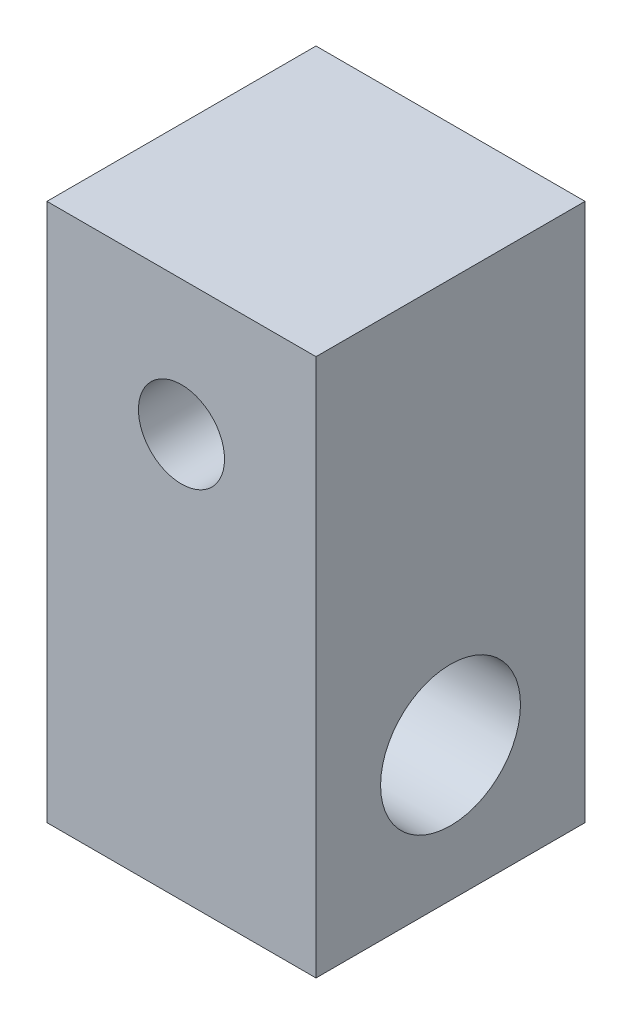
ISO-10303-21;
HEADER;
FILE_DESCRIPTION(('STEP AP214'),'2;1');
FILE_NAME('part.step','',(''),(''),'','','');
FILE_SCHEMA(('AUTOMOTIVE_DESIGN { 1 0 10303 214 1 1 1 1 }'));
ENDSEC;
DATA;
#1=APPLICATION_CONTEXT('core data for automotive mechanical design processes');
#2=APPLICATION_PROTOCOL_DEFINITION('international standard','automotive_design',2000,#1);
#3=PRODUCT_CONTEXT('',#1,'mechanical');
#4=PRODUCT('Part','Part','',(#3));
#5=PRODUCT_RELATED_PRODUCT_CATEGORY('part','',(#4));
#6=PRODUCT_DEFINITION_FORMATION('','',#4);
#7=PRODUCT_DEFINITION_CONTEXT('part definition',#1,'design');
#8=PRODUCT_DEFINITION('design','',#6,#7);
#9=PRODUCT_DEFINITION_SHAPE('','',#8);
#10=(LENGTH_UNIT() NAMED_UNIT(*) SI_UNIT(.MILLI.,.METRE.));
#11=(NAMED_UNIT(*) PLANE_ANGLE_UNIT() SI_UNIT($,.RADIAN.));
#12=(NAMED_UNIT(*) SI_UNIT($,.STERADIAN.) SOLID_ANGLE_UNIT());
#13=UNCERTAINTY_MEASURE_WITH_UNIT(LENGTH_MEASURE(1.E-05),#10,'distance_accuracy_value','');
#14=(GEOMETRIC_REPRESENTATION_CONTEXT(3) GLOBAL_UNCERTAINTY_ASSIGNED_CONTEXT((#13)) GLOBAL_UNIT_ASSIGNED_CONTEXT((#10,
#11,#12)) REPRESENTATION_CONTEXT('',''));
#15=CARTESIAN_POINT('',(0.,0.,0.));
#16=DIRECTION('',(0.,0.,1.));
#17=DIRECTION('',(1.,0.,0.));
#18=AXIS2_PLACEMENT_3D('',#15,#16,#17);
#19=CARTESIAN_POINT('',(0.,20.,10.));
#20=DIRECTION('',(1.,0.,0.));
#21=DIRECTION('',(0.,1.,0.));
#22=AXIS2_PLACEMENT_3D('',#19,#20,#21);
#23=PLANE('',#22);
#24=CARTESIAN_POINT('',(0.,5.,5.));
#25=DIRECTION('',(1.,0.,0.));
#26=DIRECTION('',(0.,1.,0.));
#27=AXIS2_PLACEMENT_3D('',#24,#25,#26);
#28=CIRCLE('',#27,2.6);
#29=CARTESIAN_POINT('',(0.,7.6,5.));
#30=VERTEX_POINT('',#29);
#31=EDGE_CURVE('E101',#30,#30,#28,.T.);
#32=ORIENTED_EDGE('',*,*,#31,.T.);
#33=EDGE_LOOP('',(#32));
#34=FACE_BOUND('',#33,.T.);
#35=DIRECTION('',(0.,-1.,0.));
#36=VECTOR('',#35,1.);
#37=CARTESIAN_POINT('',(0.,20.,0.));
#38=LINE('',#37,#36);
#39=CARTESIAN_POINT('',(0.,20.,0.));
#40=VERTEX_POINT('',#39);
#41=CARTESIAN_POINT('',(0.,0.,0.));
#42=VERTEX_POINT('',#41);
#43=EDGE_CURVE('E98',#40,#42,#38,.T.);
#44=ORIENTED_EDGE('',*,*,#43,.T.);
#45=DIRECTION('',(0.,0.,-1.));
#46=VECTOR('',#45,1.);
#47=CARTESIAN_POINT('',(0.,0.,10.));
#48=LINE('',#47,#46);
#49=CARTESIAN_POINT('',(0.,0.,10.));
#50=VERTEX_POINT('',#49);
#51=EDGE_CURVE('E11',#50,#42,#48,.T.);
#52=ORIENTED_EDGE('',*,*,#51,.F.);
#53=DIRECTION('',(0.,-1.,0.));
#54=VECTOR('',#53,1.);
#55=CARTESIAN_POINT('',(0.,20.,10.));
#56=LINE('',#55,#54);
#57=CARTESIAN_POINT('',(0.,20.,10.));
#58=VERTEX_POINT('',#57);
#59=EDGE_CURVE('E86',#58,#50,#56,.T.);
#60=ORIENTED_EDGE('',*,*,#59,.F.);
#61=DIRECTION('',(0.,0.,-1.));
#62=VECTOR('',#61,1.);
#63=CARTESIAN_POINT('',(0.,20.,10.));
#64=LINE('',#63,#62);
#65=EDGE_CURVE('E94',#58,#40,#64,.T.);
#66=ORIENTED_EDGE('',*,*,#65,.T.);
#67=EDGE_LOOP('',(#44,#52,#60,#66));
#68=FACE_BOUND('',#67,.T.);
#69=ADVANCED_FACE('F35',(#34,#68),#23,.F.);
#70=CARTESIAN_POINT('',(0.,0.,10.));
#71=DIRECTION('',(0.,1.,0.));
#72=DIRECTION('',(0.,0.,1.));
#73=AXIS2_PLACEMENT_3D('',#70,#71,#72);
#74=PLANE('',#73);
#75=DIRECTION('',(1.,0.,0.));
#76=VECTOR('',#75,1.);
#77=CARTESIAN_POINT('',(0.,0.,0.));
#78=LINE('',#77,#76);
#79=CARTESIAN_POINT('',(10.,0.,0.));
#80=VERTEX_POINT('',#79);
#81=EDGE_CURVE('E90',#42,#80,#78,.T.);
#82=ORIENTED_EDGE('',*,*,#81,.T.);
#83=DIRECTION('',(0.,0.,-1.));
#84=VECTOR('',#83,1.);
#85=CARTESIAN_POINT('',(10.,0.,10.));
#86=LINE('',#85,#84);
#87=CARTESIAN_POINT('',(10.,0.,10.));
#88=VERTEX_POINT('',#87);
#89=EDGE_CURVE('E43',#88,#80,#86,.T.);
#90=ORIENTED_EDGE('',*,*,#89,.F.);
#91=DIRECTION('',(1.,0.,0.));
#92=VECTOR('',#91,1.);
#93=CARTESIAN_POINT('',(0.,0.,10.));
#94=LINE('',#93,#92);
#95=EDGE_CURVE('E81',#50,#88,#94,.T.);
#96=ORIENTED_EDGE('',*,*,#95,.F.);
#97=ORIENTED_EDGE('',*,*,#51,.T.);
#98=EDGE_LOOP('',(#82,#90,#96,#97));
#99=FACE_BOUND('',#98,.T.);
#100=ADVANCED_FACE('F89',(#99),#74,.F.);
#101=CARTESIAN_POINT('',(10.,20.,10.));
#102=DIRECTION('',(-1.,0.,0.));
#103=DIRECTION('',(0.,-1.,0.));
#104=AXIS2_PLACEMENT_3D('',#101,#102,#103);
#105=PLANE('',#104);
#106=CARTESIAN_POINT('',(10.,5.,5.));
#107=DIRECTION('',(1.,0.,0.));
#108=DIRECTION('',(0.,1.,0.));
#109=AXIS2_PLACEMENT_3D('',#106,#107,#108);
#110=CIRCLE('',#109,2.6);
#111=CARTESIAN_POINT('',(10.,7.6,5.));
#112=VERTEX_POINT('',#111);
#113=EDGE_CURVE('E112',#112,#112,#110,.T.);
#114=ORIENTED_EDGE('',*,*,#113,.F.);
#115=EDGE_LOOP('',(#114));
#116=FACE_BOUND('',#115,.T.);
#117=DIRECTION('',(0.,1.,0.));
#118=VECTOR('',#117,1.);
#119=CARTESIAN_POINT('',(10.,20.,0.));
#120=LINE('',#119,#118);
#121=CARTESIAN_POINT('',(10.,20.,0.));
#122=VERTEX_POINT('',#121);
#123=EDGE_CURVE('E68',#80,#122,#120,.T.);
#124=ORIENTED_EDGE('',*,*,#123,.T.);
#125=DIRECTION('',(0.,0.,-1.));
#126=VECTOR('',#125,1.);
#127=CARTESIAN_POINT('',(10.,20.,10.));
#128=LINE('',#127,#126);
#129=CARTESIAN_POINT('',(10.,20.,10.));
#130=VERTEX_POINT('',#129);
#131=EDGE_CURVE('E91',#130,#122,#128,.T.);
#132=ORIENTED_EDGE('',*,*,#131,.F.);
#133=DIRECTION('',(0.,1.,0.));
#134=VECTOR('',#133,1.);
#135=CARTESIAN_POINT('',(10.,20.,10.));
#136=LINE('',#135,#134);
#137=EDGE_CURVE('E84',#88,#130,#136,.T.);
#138=ORIENTED_EDGE('',*,*,#137,.F.);
#139=ORIENTED_EDGE('',*,*,#89,.T.);
#140=EDGE_LOOP('',(#124,#132,#138,#139));
#141=FACE_BOUND('',#140,.T.);
#142=ADVANCED_FACE('F92',(#116,#141),#105,.F.);
#143=CARTESIAN_POINT('',(0.,20.,10.));
#144=DIRECTION('',(0.,-1.,0.));
#145=DIRECTION('',(0.,0.,-1.));
#146=AXIS2_PLACEMENT_3D('',#143,#144,#145);
#147=PLANE('',#146);
#148=DIRECTION('',(-1.,0.,0.));
#149=VECTOR('',#148,1.);
#150=CARTESIAN_POINT('',(0.,20.,0.));
#151=LINE('',#150,#149);
#152=EDGE_CURVE('E74',#122,#40,#151,.T.);
#153=ORIENTED_EDGE('',*,*,#152,.T.);
#154=ORIENTED_EDGE('',*,*,#65,.F.);
#155=DIRECTION('',(-1.,0.,0.));
#156=VECTOR('',#155,1.);
#157=CARTESIAN_POINT('',(0.,20.,10.));
#158=LINE('',#157,#156);
#159=EDGE_CURVE('E51',#130,#58,#158,.T.);
#160=ORIENTED_EDGE('',*,*,#159,.F.);
#161=ORIENTED_EDGE('',*,*,#131,.T.);
#162=EDGE_LOOP('',(#153,#154,#160,#161));
#163=FACE_BOUND('',#162,.T.);
#164=ADVANCED_FACE('F106',(#163),#147,.F.);
#165=CARTESIAN_POINT('',(0.,0.,10.));
#166=DIRECTION('',(0.,0.,1.));
#167=DIRECTION('',(1.,0.,0.));
#168=AXIS2_PLACEMENT_3D('',#165,#166,#167);
#169=PLANE('',#168);
#170=CARTESIAN_POINT('',(5.,15.,10.));
#171=DIRECTION('',(0.,0.,1.));
#172=DIRECTION('',(1.,0.,0.));
#173=AXIS2_PLACEMENT_3D('',#170,#171,#172);
#174=CIRCLE('',#173,1.6);
#175=CARTESIAN_POINT('',(6.6,15.,10.));
#176=VERTEX_POINT('',#175);
#177=EDGE_CURVE('E118',#176,#176,#174,.T.);
#178=ORIENTED_EDGE('',*,*,#177,.F.);
#179=EDGE_LOOP('',(#178));
#180=FACE_BOUND('',#179,.T.);
#181=ORIENTED_EDGE('',*,*,#59,.T.);
#182=ORIENTED_EDGE('',*,*,#95,.T.);
#183=ORIENTED_EDGE('',*,*,#137,.T.);
#184=ORIENTED_EDGE('',*,*,#159,.T.);
#185=EDGE_LOOP('',(#181,#182,#183,#184));
#186=FACE_BOUND('',#185,.T.);
#187=ADVANCED_FACE('F82',(#180,#186),#169,.T.);
#188=CARTESIAN_POINT('',(0.,0.,0.));
#189=DIRECTION('',(0.,0.,1.));
#190=DIRECTION('',(1.,0.,0.));
#191=AXIS2_PLACEMENT_3D('',#188,#189,#190);
#192=PLANE('',#191);
#193=CARTESIAN_POINT('',(5.,15.,0.));
#194=DIRECTION('',(0.,0.,1.));
#195=DIRECTION('',(1.,0.,0.));
#196=AXIS2_PLACEMENT_3D('',#193,#194,#195);
#197=CIRCLE('',#196,1.6);
#198=CARTESIAN_POINT('',(6.6,15.,0.));
#199=VERTEX_POINT('',#198);
#200=EDGE_CURVE('E115',#199,#199,#197,.T.);
#201=ORIENTED_EDGE('',*,*,#200,.T.);
#202=EDGE_LOOP('',(#201));
#203=FACE_BOUND('',#202,.T.);
#204=ORIENTED_EDGE('',*,*,#43,.F.);
#205=ORIENTED_EDGE('',*,*,#152,.F.);
#206=ORIENTED_EDGE('',*,*,#123,.F.);
#207=ORIENTED_EDGE('',*,*,#81,.F.);
#208=EDGE_LOOP('',(#204,#205,#206,#207));
#209=FACE_BOUND('',#208,.T.);
#210=ADVANCED_FACE('F109',(#203,#209),#192,.F.);
#211=CARTESIAN_POINT('',(0.,5.,5.));
#212=DIRECTION('',(1.,0.,0.));
#213=DIRECTION('',(0.,1.,0.));
#214=AXIS2_PLACEMENT_3D('',#211,#212,#213);
#215=CYLINDRICAL_SURFACE('',#214,2.6);
#216=CARTESIAN_POINT('',(0.,7.6,5.));
#217=CARTESIAN_POINT('',(0.104166666666665,7.6,5.));
#218=CARTESIAN_POINT('',(0.208333333333331,7.6,5.));
#219=CARTESIAN_POINT('',(0.416666666666665,7.6,5.));
#220=CARTESIAN_POINT('',(0.520833333333331,7.6,5.));
#221=CARTESIAN_POINT('',(0.729166666666665,7.6,5.));
#222=CARTESIAN_POINT('',(0.833333333333332,7.6,5.));
#223=CARTESIAN_POINT('',(1.04166666666667,7.6,5.));
#224=CARTESIAN_POINT('',(1.14583333333333,7.6,5.));
#225=CARTESIAN_POINT('',(1.35416666666667,7.6,5.));
#226=CARTESIAN_POINT('',(1.45833333333333,7.6,5.));
#227=CARTESIAN_POINT('',(1.66666666666667,7.6,5.));
#228=CARTESIAN_POINT('',(1.77083333333333,7.6,5.));
#229=CARTESIAN_POINT('',(1.97916666666667,7.6,5.));
#230=CARTESIAN_POINT('',(2.08333333333333,7.6,5.));
#231=CARTESIAN_POINT('',(2.29166666666667,7.6,5.));
#232=CARTESIAN_POINT('',(2.39583333333333,7.6,5.));
#233=CARTESIAN_POINT('',(2.60416666666667,7.6,5.));
#234=CARTESIAN_POINT('',(2.70833333333333,7.6,5.));
#235=CARTESIAN_POINT('',(2.91666666666667,7.6,5.));
#236=CARTESIAN_POINT('',(3.02083333333333,7.6,5.));
#237=CARTESIAN_POINT('',(3.22916666666667,7.6,5.));
#238=CARTESIAN_POINT('',(3.33333333333333,7.6,5.));
#239=CARTESIAN_POINT('',(3.54166666666667,7.6,5.));
#240=CARTESIAN_POINT('',(3.64583333333333,7.6,5.));
#241=CARTESIAN_POINT('',(3.85416666666667,7.6,5.));
#242=CARTESIAN_POINT('',(3.95833333333333,7.6,5.));
#243=CARTESIAN_POINT('',(4.16666666666667,7.6,5.));
#244=CARTESIAN_POINT('',(4.27083333333333,7.6,5.));
#245=CARTESIAN_POINT('',(4.47916666666667,7.6,5.));
#246=CARTESIAN_POINT('',(4.58333333333333,7.6,5.));
#247=CARTESIAN_POINT('',(4.79166666666667,7.6,5.));
#248=CARTESIAN_POINT('',(4.89583333333333,7.6,5.));
#249=CARTESIAN_POINT('',(5.10416666666667,7.6,5.));
#250=CARTESIAN_POINT('',(5.20833333333333,7.6,5.));
#251=CARTESIAN_POINT('',(5.41666666666667,7.6,5.));
#252=CARTESIAN_POINT('',(5.52083333333333,7.6,5.));
#253=CARTESIAN_POINT('',(5.72916666666667,7.6,5.));
#254=CARTESIAN_POINT('',(5.83333333333333,7.6,5.));
#255=CARTESIAN_POINT('',(6.04166666666667,7.6,5.));
#256=CARTESIAN_POINT('',(6.14583333333333,7.6,5.));
#257=CARTESIAN_POINT('',(6.35416666666667,7.6,5.));
#258=CARTESIAN_POINT('',(6.45833333333333,7.6,5.));
#259=CARTESIAN_POINT('',(6.66666666666667,7.6,5.));
#260=CARTESIAN_POINT('',(6.77083333333333,7.6,5.));
#261=CARTESIAN_POINT('',(6.97916666666667,7.6,5.));
#262=CARTESIAN_POINT('',(7.08333333333333,7.6,5.));
#263=CARTESIAN_POINT('',(7.29166666666667,7.6,5.));
#264=CARTESIAN_POINT('',(7.39583333333333,7.6,5.));
#265=CARTESIAN_POINT('',(7.60416666666667,7.6,5.));
#266=CARTESIAN_POINT('',(7.70833333333333,7.6,5.));
#267=CARTESIAN_POINT('',(7.91666666666667,7.6,5.));
#268=CARTESIAN_POINT('',(8.02083333333333,7.6,5.));
#269=CARTESIAN_POINT('',(8.22916666666667,7.6,5.));
#270=CARTESIAN_POINT('',(8.33333333333333,7.6,5.));
#271=CARTESIAN_POINT('',(8.54166666666667,7.6,5.));
#272=CARTESIAN_POINT('',(8.64583333333333,7.6,5.));
#273=CARTESIAN_POINT('',(8.85416666666667,7.6,5.));
#274=CARTESIAN_POINT('',(8.95833333333333,7.6,5.));
#275=CARTESIAN_POINT('',(9.16666666666667,7.6,5.));
#276=CARTESIAN_POINT('',(9.27083333333333,7.6,5.));
#277=CARTESIAN_POINT('',(9.47916666666667,7.6,5.));
#278=CARTESIAN_POINT('',(9.58333333333333,7.6,5.));
#279=CARTESIAN_POINT('',(9.79166666666667,7.6,5.));
#280=CARTESIAN_POINT('',(9.89583333333333,7.6,5.));
#281=CARTESIAN_POINT('',(10.,7.6,5.));
#282=B_SPLINE_CURVE_WITH_KNOTS('',3,(#216,#217,#218,#219,#220,#221,#222,#223,#224,#225,#226,
#227,#228,#229,#230,#231,#232,#233,#234,#235,#236,#237,#238,#239,#240,#241,#242,#243,#244,#245,
#246,#247,#248,#249,#250,#251,#252,#253,#254,#255,#256,#257,#258,#259,#260,#261,#262,#263,#264,
#265,#266,#267,#268,#269,#270,#271,#272,#273,#274,#275,#276,#277,#278,#279,#280,#281),
.UNSPECIFIED.,.F.,.F.,(4,2,2,2,2,2,2,2,2,2,2,2,2,2,2,2,2,2,2,2,2,2,2,2,2,2,2,2,2,2,2,2,4),(0.,
0.3125,0.625,0.9375,1.25,1.5625,1.875,2.1875,2.5,2.8125,3.125,3.4375,3.75,4.0625,4.375,4.6875,
5.,5.3125,5.625,5.9375,6.25,6.5625,6.875,7.1875,7.5,7.8125,8.125,8.4375,8.75,9.06250000000001,
9.37500000000001,9.68750000000001,10.),.UNSPECIFIED.);
#283=EDGE_CURVE('BSEAM128',#30,#112,#282,.T.);
#284=ORIENTED_EDGE('',*,*,#31,.F.);
#285=ORIENTED_EDGE('',*,*,#113,.T.);
#286=ORIENTED_EDGE('',*,*,#283,.T.);
#287=ORIENTED_EDGE('',*,*,#283,.F.);
#288=EDGE_LOOP('',(#284,#286,#285,#287));
#289=FACE_BOUND('',#288,.T.);
#290=ADVANCED_FACE('F128',(#289),#215,.F.);
#291=CARTESIAN_POINT('',(5.,15.,0.));
#292=DIRECTION('',(0.,0.,1.));
#293=DIRECTION('',(1.,0.,0.));
#294=AXIS2_PLACEMENT_3D('',#291,#292,#293);
#295=CYLINDRICAL_SURFACE('',#294,1.6);
#296=ORIENTED_EDGE('',*,*,#200,.F.);
#297=EDGE_LOOP('',(#296));
#298=FACE_BOUND('',#297,.T.);
#299=ORIENTED_EDGE('',*,*,#177,.T.);
#300=EDGE_LOOP('',(#299));
#301=FACE_BOUND('',#300,.T.);
#302=ADVANCED_FACE('F125',(#298,#301),#295,.F.);
#303=CLOSED_SHELL('',(#69,#100,#142,#164,#187,#210,#290,#302));
#304=MANIFOLD_SOLID_BREP('B2',#303);
#305=ADVANCED_BREP_SHAPE_REPRESENTATION('',(#18,#304),#14);
#306=SHAPE_DEFINITION_REPRESENTATION(#9,#305);
ENDSEC;
END-ISO-10303-21;
